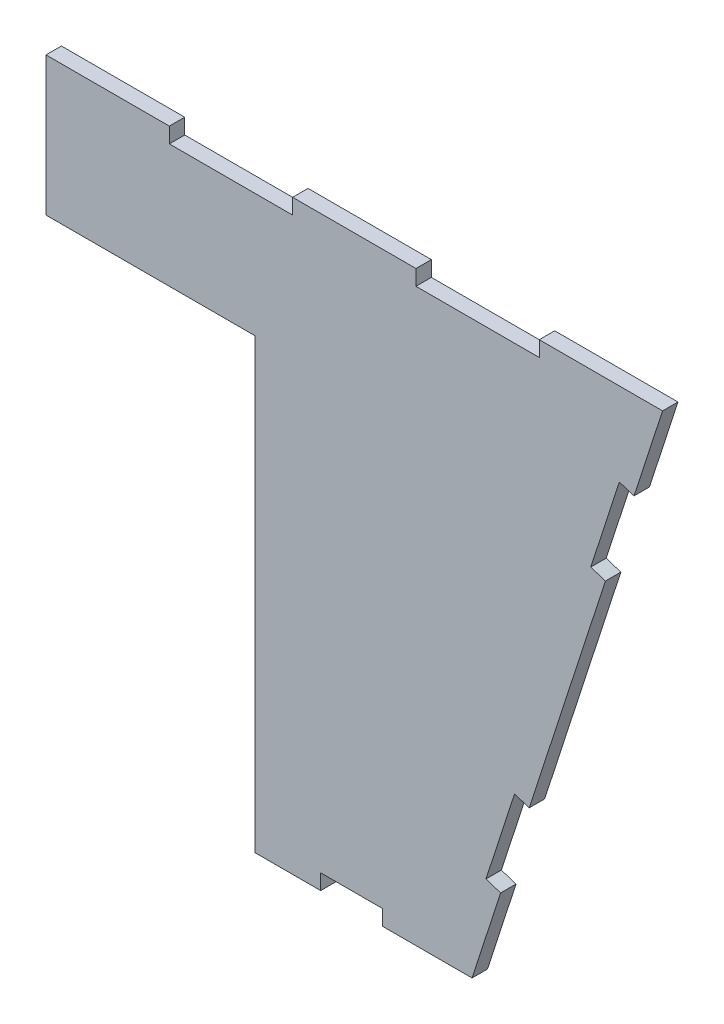
ISO-10303-21;
HEADER;
FILE_DESCRIPTION(('STEP AP214'),'2;1');
FILE_NAME('part.step','',(''),(''),'','','');
FILE_SCHEMA(('AUTOMOTIVE_DESIGN { 1 0 10303 214 1 1 1 1 }'));
ENDSEC;
DATA;
#1=APPLICATION_CONTEXT('core data for automotive mechanical design processes');
#2=APPLICATION_PROTOCOL_DEFINITION('international standard','automotive_design',2000,#1);
#3=PRODUCT_CONTEXT('',#1,'mechanical');
#4=PRODUCT('Part','Part','',(#3));
#5=PRODUCT_RELATED_PRODUCT_CATEGORY('part','',(#4));
#6=PRODUCT_DEFINITION_FORMATION('','',#4);
#7=PRODUCT_DEFINITION_CONTEXT('part definition',#1,'design');
#8=PRODUCT_DEFINITION('design','',#6,#7);
#9=PRODUCT_DEFINITION_SHAPE('','',#8);
#10=(LENGTH_UNIT() NAMED_UNIT(*) SI_UNIT(.MILLI.,.METRE.));
#11=(NAMED_UNIT(*) PLANE_ANGLE_UNIT() SI_UNIT($,.RADIAN.));
#12=(NAMED_UNIT(*) SI_UNIT($,.STERADIAN.) SOLID_ANGLE_UNIT());
#13=UNCERTAINTY_MEASURE_WITH_UNIT(LENGTH_MEASURE(1.E-05),#10,'distance_accuracy_value','');
#14=(GEOMETRIC_REPRESENTATION_CONTEXT(3) GLOBAL_UNCERTAINTY_ASSIGNED_CONTEXT((#13)) GLOBAL_UNIT_ASSIGNED_CONTEXT((#10,
#11,#12)) REPRESENTATION_CONTEXT('',''));
#15=CARTESIAN_POINT('',(0.,0.,0.));
#16=DIRECTION('',(0.,0.,1.));
#17=DIRECTION('',(1.,0.,0.));
#18=AXIS2_PLACEMENT_3D('',#15,#16,#17);
#19=CARTESIAN_POINT('',(-18.477420857191,0.,3.175));
#20=DIRECTION('',(0.,1.,0.));
#21=DIRECTION('',(0.,0.,1.));
#22=AXIS2_PLACEMENT_3D('',#19,#20,#21);
#23=PLANE('',#22);
#24=DIRECTION('',(1.,0.,0.));
#25=VECTOR('',#24,1.);
#26=CARTESIAN_POINT('',(-18.477420857191,0.,0.));
#27=LINE('',#26,#25);
#28=CARTESIAN_POINT('',(-18.477420857191,0.,0.));
#29=VERTEX_POINT('',#28);
#30=CARTESIAN_POINT('',(0.,0.,0.));
#31=VERTEX_POINT('',#30);
#32=EDGE_CURVE('E239',#29,#31,#27,.T.);
#33=ORIENTED_EDGE('',*,*,#32,.T.);
#34=DIRECTION('',(0.,0.,-1.));
#35=VECTOR('',#34,1.);
#36=CARTESIAN_POINT('',(0.,0.,3.175));
#37=LINE('',#36,#35);
#38=CARTESIAN_POINT('',(0.,0.,3.175));
#39=VERTEX_POINT('',#38);
#40=EDGE_CURVE('E11',#39,#31,#37,.T.);
#41=ORIENTED_EDGE('',*,*,#40,.F.);
#42=DIRECTION('',(1.,0.,0.));
#43=VECTOR('',#42,1.);
#44=CARTESIAN_POINT('',(-18.477420857191,0.,3.175));
#45=LINE('',#44,#43);
#46=CARTESIAN_POINT('',(-18.477420857191,0.,3.175));
#47=VERTEX_POINT('',#46);
#48=EDGE_CURVE('E289',#47,#39,#45,.T.);
#49=ORIENTED_EDGE('',*,*,#48,.F.);
#50=DIRECTION('',(0.,0.,-1.));
#51=VECTOR('',#50,1.);
#52=CARTESIAN_POINT('',(-18.477420857191,0.,3.175));
#53=LINE('',#52,#51);
#54=EDGE_CURVE('E235',#47,#29,#53,.T.);
#55=ORIENTED_EDGE('',*,*,#54,.T.);
#56=EDGE_LOOP('',(#33,#41,#49,#55));
#57=FACE_BOUND('',#56,.T.);
#58=ADVANCED_FACE('F35',(#57),#23,.F.);
#59=CARTESIAN_POINT('',(0.,0.,3.175));
#60=DIRECTION('',(-0.951056516295155,0.309016994374945,0.));
#61=DIRECTION('',(-0.309016994374945,-0.951056516295155,0.));
#62=AXIS2_PLACEMENT_3D('',#59,#60,#61);
#63=PLANE('',#62);
#64=DIRECTION('',(0.309016994374945,0.951056516295154,0.));
#65=VECTOR('',#64,1.);
#66=CARTESIAN_POINT('',(0.,0.,0.));
#67=LINE('',#66,#65);
#68=CARTESIAN_POINT('',(5.88677374284271,18.1176266354227,0.));
#69=VERTEX_POINT('',#68);
#70=EDGE_CURVE('E242',#31,#69,#67,.T.);
#71=ORIENTED_EDGE('',*,*,#70,.T.);
#72=DIRECTION('',(0.,0.,-1.));
#73=VECTOR('',#72,1.);
#74=CARTESIAN_POINT('',(5.88677374284271,18.1176266354227,3.175));
#75=LINE('',#74,#73);
#76=CARTESIAN_POINT('',(5.88677374284271,18.1176266354227,3.175));
#77=VERTEX_POINT('',#76);
#78=EDGE_CURVE('E43',#77,#69,#75,.T.);
#79=ORIENTED_EDGE('',*,*,#78,.F.);
#80=DIRECTION('',(0.309016994374945,0.951056516295154,0.));
#81=VECTOR('',#80,1.);
#82=CARTESIAN_POINT('',(0.,0.,3.175));
#83=LINE('',#82,#81);
#84=EDGE_CURVE('E148',#39,#77,#83,.T.);
#85=ORIENTED_EDGE('',*,*,#84,.F.);
#86=ORIENTED_EDGE('',*,*,#40,.T.);
#87=EDGE_LOOP('',(#71,#79,#85,#86));
#88=FACE_BOUND('',#87,.T.);
#89=ADVANCED_FACE('F437',(#88),#63,.F.);
#90=CARTESIAN_POINT('',(5.88677374284271,18.1176266354227,3.175));
#91=DIRECTION('',(-0.309016994374942,-0.951056516295155,0.));
#92=DIRECTION('',(0.951056516295155,-0.309016994374942,0.));
#93=AXIS2_PLACEMENT_3D('',#90,#91,#92);
#94=PLANE('',#93);
#95=DIRECTION('',(-0.951056516295155,0.309016994374942,0.));
#96=VECTOR('',#95,1.);
#97=CARTESIAN_POINT('',(5.88677374284271,18.1176266354227,0.));
#98=LINE('',#97,#96);
#99=CARTESIAN_POINT('',(2.86716930360559,19.0987555925632,0.));
#100=VERTEX_POINT('',#99);
#101=EDGE_CURVE('E244',#69,#100,#98,.T.);
#102=ORIENTED_EDGE('',*,*,#101,.T.);
#103=DIRECTION('',(0.,0.,-1.));
#104=VECTOR('',#103,1.);
#105=CARTESIAN_POINT('',(2.86716930360559,19.0987555925632,3.175));
#106=LINE('',#105,#104);
#107=CARTESIAN_POINT('',(2.86716930360559,19.0987555925632,3.175));
#108=VERTEX_POINT('',#107);
#109=EDGE_CURVE('E350',#108,#100,#106,.T.);
#110=ORIENTED_EDGE('',*,*,#109,.F.);
#111=DIRECTION('',(-0.951056516295155,0.309016994374942,0.));
#112=VECTOR('',#111,1.);
#113=CARTESIAN_POINT('',(5.88677374284271,18.1176266354227,3.175));
#114=LINE('',#113,#112);
#115=EDGE_CURVE('E358',#77,#108,#114,.T.);
#116=ORIENTED_EDGE('',*,*,#115,.F.);
#117=ORIENTED_EDGE('',*,*,#78,.T.);
#118=EDGE_LOOP('',(#102,#110,#116,#117));
#119=FACE_BOUND('',#118,.T.);
#120=ADVANCED_FACE('F356',(#119),#94,.F.);
#121=CARTESIAN_POINT('',(2.86716930360559,19.0987555925632,3.175));
#122=DIRECTION('',(-0.951056516295154,0.309016994374946,0.));
#123=DIRECTION('',(-0.309016994374946,-0.951056516295154,0.));
#124=AXIS2_PLACEMENT_3D('',#121,#122,#123);
#125=PLANE('',#124);
#126=DIRECTION('',(0.309016994374946,0.951056516295154,0.));
#127=VECTOR('',#126,1.);
#128=CARTESIAN_POINT('',(2.86716930360559,19.0987555925632,0.));
#129=LINE('',#128,#127);
#130=CARTESIAN_POINT('',(8.75394304644831,37.2163822279859,0.));
#131=VERTEX_POINT('',#130);
#132=EDGE_CURVE('E246',#100,#131,#129,.T.);
#133=ORIENTED_EDGE('',*,*,#132,.T.);
#134=DIRECTION('',(0.,0.,-1.));
#135=VECTOR('',#134,1.);
#136=CARTESIAN_POINT('',(8.75394304644831,37.2163822279859,3.175));
#137=LINE('',#136,#135);
#138=CARTESIAN_POINT('',(8.75394304644831,37.2163822279859,3.175));
#139=VERTEX_POINT('',#138);
#140=EDGE_CURVE('E347',#139,#131,#137,.T.);
#141=ORIENTED_EDGE('',*,*,#140,.F.);
#142=DIRECTION('',(0.309016994374946,0.951056516295154,0.));
#143=VECTOR('',#142,1.);
#144=CARTESIAN_POINT('',(2.86716930360559,19.0987555925632,3.175));
#145=LINE('',#144,#143);
#146=EDGE_CURVE('E376',#108,#139,#145,.T.);
#147=ORIENTED_EDGE('',*,*,#146,.F.);
#148=ORIENTED_EDGE('',*,*,#109,.T.);
#149=EDGE_LOOP('',(#133,#141,#147,#148));
#150=FACE_BOUND('',#149,.T.);
#151=ADVANCED_FACE('F367',(#150),#125,.F.);
#152=CARTESIAN_POINT('',(8.75394304644831,37.2163822279859,3.175));
#153=DIRECTION('',(0.309016994374942,0.951056516295155,0.));
#154=DIRECTION('',(-0.951056516295155,0.309016994374942,0.));
#155=AXIS2_PLACEMENT_3D('',#152,#153,#154);
#156=PLANE('',#155);
#157=DIRECTION('',(0.951056516295155,-0.309016994374942,0.));
#158=VECTOR('',#157,1.);
#159=CARTESIAN_POINT('',(8.75394304644831,37.2163822279859,0.));
#160=LINE('',#159,#158);
#161=CARTESIAN_POINT('',(11.7735474856854,36.2352532708454,0.));
#162=VERTEX_POINT('',#161);
#163=EDGE_CURVE('E248',#131,#162,#160,.T.);
#164=ORIENTED_EDGE('',*,*,#163,.T.);
#165=DIRECTION('',(0.,0.,-1.));
#166=VECTOR('',#165,1.);
#167=CARTESIAN_POINT('',(11.7735474856854,36.2352532708454,3.175));
#168=LINE('',#167,#166);
#169=CARTESIAN_POINT('',(11.7735474856854,36.2352532708454,3.175));
#170=VERTEX_POINT('',#169);
#171=EDGE_CURVE('E344',#170,#162,#168,.T.);
#172=ORIENTED_EDGE('',*,*,#171,.F.);
#173=DIRECTION('',(0.951056516295155,-0.309016994374942,0.));
#174=VECTOR('',#173,1.);
#175=CARTESIAN_POINT('',(8.75394304644831,37.2163822279859,3.175));
#176=LINE('',#175,#174);
#177=EDGE_CURVE('E373',#139,#170,#176,.T.);
#178=ORIENTED_EDGE('',*,*,#177,.F.);
#179=ORIENTED_EDGE('',*,*,#140,.T.);
#180=EDGE_LOOP('',(#164,#172,#178,#179));
#181=FACE_BOUND('',#180,.T.);
#182=ADVANCED_FACE('F371',(#181),#156,.F.);
#183=CARTESIAN_POINT('',(11.7735474856854,36.2352532708454,3.175));
#184=DIRECTION('',(-0.951056516295154,0.309016994374945,0.));
#185=DIRECTION('',(-0.309016994374945,-0.951056516295155,0.));
#186=AXIS2_PLACEMENT_3D('',#183,#184,#185);
#187=PLANE('',#186);
#188=DIRECTION('',(0.309016994374945,0.951056516295154,0.));
#189=VECTOR('',#188,1.);
#190=CARTESIAN_POINT('',(11.7735474856854,36.2352532708454,0.));
#191=LINE('',#190,#189);
#192=CARTESIAN_POINT('',(27.4716107999326,84.5489242986392,0.));
#193=VERTEX_POINT('',#192);
#194=EDGE_CURVE('E250',#162,#193,#191,.T.);
#195=ORIENTED_EDGE('',*,*,#194,.T.);
#196=DIRECTION('',(0.,0.,-1.));
#197=VECTOR('',#196,1.);
#198=CARTESIAN_POINT('',(27.4716107999326,84.5489242986392,3.175));
#199=LINE('',#198,#197);
#200=CARTESIAN_POINT('',(27.4716107999326,84.5489242986392,3.175));
#201=VERTEX_POINT('',#200);
#202=EDGE_CURVE('E341',#201,#193,#199,.T.);
#203=ORIENTED_EDGE('',*,*,#202,.F.);
#204=DIRECTION('',(0.309016994374945,0.951056516295154,0.));
#205=VECTOR('',#204,1.);
#206=CARTESIAN_POINT('',(11.7735474856854,36.2352532708454,3.175));
#207=LINE('',#206,#205);
#208=EDGE_CURVE('E375',#170,#201,#207,.T.);
#209=ORIENTED_EDGE('',*,*,#208,.F.);
#210=ORIENTED_EDGE('',*,*,#171,.T.);
#211=EDGE_LOOP('',(#195,#203,#209,#210));
#212=FACE_BOUND('',#211,.T.);
#213=ADVANCED_FACE('F450',(#212),#187,.F.);
#214=CARTESIAN_POINT('',(24.4520063606955,85.5300532557796,3.175));
#215=DIRECTION('',(-0.309016994374941,-0.951056516295156,0.));
#216=DIRECTION('',(0.951056516295156,-0.309016994374941,0.));
#217=AXIS2_PLACEMENT_3D('',#214,#215,#216);
#218=PLANE('',#217);
#219=DIRECTION('',(-0.951056516295155,0.309016994374941,0.));
#220=VECTOR('',#219,1.);
#221=CARTESIAN_POINT('',(24.4520063606955,85.5300532557796,0.));
#222=LINE('',#221,#220);
#223=CARTESIAN_POINT('',(24.4520063606955,85.5300532557796,0.));
#224=VERTEX_POINT('',#223);
#225=EDGE_CURVE('E252',#193,#224,#222,.T.);
#226=ORIENTED_EDGE('',*,*,#225,.T.);
#227=DIRECTION('',(0.,0.,-1.));
#228=VECTOR('',#227,1.);
#229=CARTESIAN_POINT('',(24.4520063606955,85.5300532557796,3.175));
#230=LINE('',#229,#228);
#231=CARTESIAN_POINT('',(24.4520063606955,85.5300532557796,3.175));
#232=VERTEX_POINT('',#231);
#233=EDGE_CURVE('E338',#232,#224,#230,.T.);
#234=ORIENTED_EDGE('',*,*,#233,.F.);
#235=DIRECTION('',(-0.951056516295155,0.309016994374941,0.));
#236=VECTOR('',#235,1.);
#237=CARTESIAN_POINT('',(24.4520063606955,85.5300532557796,3.175));
#238=LINE('',#237,#236);
#239=EDGE_CURVE('E378',#201,#232,#238,.T.);
#240=ORIENTED_EDGE('',*,*,#239,.F.);
#241=ORIENTED_EDGE('',*,*,#202,.T.);
#242=EDGE_LOOP('',(#226,#234,#240,#241));
#243=FACE_BOUND('',#242,.T.);
#244=ADVANCED_FACE('F453',(#243),#218,.F.);
#245=CARTESIAN_POINT('',(30.3387801035382,103.647679891202,3.175));
#246=DIRECTION('',(-0.951056516295155,0.309016994374944,0.));
#247=DIRECTION('',(-0.309016994374944,-0.951056516295155,0.));
#248=AXIS2_PLACEMENT_3D('',#245,#246,#247);
#249=PLANE('',#248);
#250=DIRECTION('',(0.309016994374944,0.951056516295155,0.));
#251=VECTOR('',#250,1.);
#252=CARTESIAN_POINT('',(30.3387801035382,103.647679891202,0.));
#253=LINE('',#252,#251);
#254=CARTESIAN_POINT('',(30.3387801035382,103.647679891202,0.));
#255=VERTEX_POINT('',#254);
#256=EDGE_CURVE('E254',#224,#255,#253,.T.);
#257=ORIENTED_EDGE('',*,*,#256,.T.);
#258=DIRECTION('',(0.,0.,-1.));
#259=VECTOR('',#258,1.);
#260=CARTESIAN_POINT('',(30.3387801035382,103.647679891202,3.175));
#261=LINE('',#260,#259);
#262=CARTESIAN_POINT('',(30.3387801035382,103.647679891202,3.175));
#263=VERTEX_POINT('',#262);
#264=EDGE_CURVE('E335',#263,#255,#261,.T.);
#265=ORIENTED_EDGE('',*,*,#264,.F.);
#266=DIRECTION('',(0.309016994374944,0.951056516295155,0.));
#267=VECTOR('',#266,1.);
#268=CARTESIAN_POINT('',(30.3387801035382,103.647679891202,3.175));
#269=LINE('',#268,#267);
#270=EDGE_CURVE('E384',#232,#263,#269,.T.);
#271=ORIENTED_EDGE('',*,*,#270,.F.);
#272=ORIENTED_EDGE('',*,*,#233,.T.);
#273=EDGE_LOOP('',(#257,#265,#271,#272));
#274=FACE_BOUND('',#273,.T.);
#275=ADVANCED_FACE('F457',(#274),#249,.F.);
#276=CARTESIAN_POINT('',(33.3583845427752,102.666550934062,3.175));
#277=DIRECTION('',(0.309016994374943,0.951056516295155,0.));
#278=DIRECTION('',(-0.951056516295155,0.309016994374943,0.));
#279=AXIS2_PLACEMENT_3D('',#276,#277,#278);
#280=PLANE('',#279);
#281=DIRECTION('',(0.951056516295155,-0.309016994374943,0.));
#282=VECTOR('',#281,1.);
#283=CARTESIAN_POINT('',(33.3583845427752,102.666550934062,0.));
#284=LINE('',#283,#282);
#285=CARTESIAN_POINT('',(33.3583845427752,102.666550934062,0.));
#286=VERTEX_POINT('',#285);
#287=EDGE_CURVE('E256',#255,#286,#284,.T.);
#288=ORIENTED_EDGE('',*,*,#287,.T.);
#289=DIRECTION('',(0.,0.,-1.));
#290=VECTOR('',#289,1.);
#291=CARTESIAN_POINT('',(33.3583845427752,102.666550934062,3.175));
#292=LINE('',#291,#290);
#293=CARTESIAN_POINT('',(33.3583845427752,102.666550934062,3.175));
#294=VERTEX_POINT('',#293);
#295=EDGE_CURVE('E332',#294,#286,#292,.T.);
#296=ORIENTED_EDGE('',*,*,#295,.F.);
#297=DIRECTION('',(0.951056516295155,-0.309016994374943,0.));
#298=VECTOR('',#297,1.);
#299=CARTESIAN_POINT('',(33.3583845427752,102.666550934062,3.175));
#300=LINE('',#299,#298);
#301=EDGE_CURVE('E386',#263,#294,#300,.T.);
#302=ORIENTED_EDGE('',*,*,#301,.F.);
#303=ORIENTED_EDGE('',*,*,#264,.T.);
#304=EDGE_LOOP('',(#288,#296,#302,#303));
#305=FACE_BOUND('',#304,.T.);
#306=ADVANCED_FACE('F461',(#305),#280,.F.);
#307=CARTESIAN_POINT('',(33.3583845427752,102.666550934062,3.175));
#308=DIRECTION('',(-0.951056516295154,0.309016994374946,0.));
#309=DIRECTION('',(-0.309016994374946,-0.951056516295154,0.));
#310=AXIS2_PLACEMENT_3D('',#307,#308,#309);
#311=PLANE('',#310);
#312=DIRECTION('',(0.309016994374946,0.951056516295154,0.));
#313=VECTOR('',#312,1.);
#314=CARTESIAN_POINT('',(33.3583845427752,102.666550934062,0.));
#315=LINE('',#314,#313);
#316=CARTESIAN_POINT('',(39.245158285618,120.784177569485,0.));
#317=VERTEX_POINT('',#316);
#318=EDGE_CURVE('E258',#286,#317,#315,.T.);
#319=ORIENTED_EDGE('',*,*,#318,.T.);
#320=DIRECTION('',(0.,0.,-1.));
#321=VECTOR('',#320,1.);
#322=CARTESIAN_POINT('',(39.245158285618,120.784177569485,3.175));
#323=LINE('',#322,#321);
#324=CARTESIAN_POINT('',(39.245158285618,120.784177569485,3.175));
#325=VERTEX_POINT('',#324);
#326=EDGE_CURVE('E329',#325,#317,#323,.T.);
#327=ORIENTED_EDGE('',*,*,#326,.F.);
#328=DIRECTION('',(0.309016994374946,0.951056516295154,0.));
#329=VECTOR('',#328,1.);
#330=CARTESIAN_POINT('',(33.3583845427752,102.666550934062,3.175));
#331=LINE('',#330,#329);
#332=EDGE_CURVE('E388',#294,#325,#331,.T.);
#333=ORIENTED_EDGE('',*,*,#332,.F.);
#334=ORIENTED_EDGE('',*,*,#295,.T.);
#335=EDGE_LOOP('',(#319,#327,#333,#334));
#336=FACE_BOUND('',#335,.T.);
#337=ADVANCED_FACE('F465',(#336),#311,.F.);
#338=CARTESIAN_POINT('',(39.245158285618,120.784177569485,3.175));
#339=DIRECTION('',(0.,-1.,0.));
#340=DIRECTION('',(0.,0.,-1.));
#341=AXIS2_PLACEMENT_3D('',#338,#339,#340);
#342=PLANE('',#341);
#343=DIRECTION('',(-1.,0.,0.));
#344=VECTOR('',#343,1.);
#345=CARTESIAN_POINT('',(39.245158285618,120.784177569485,0.));
#346=LINE('',#345,#344);
#347=CARTESIAN_POINT('',(13.845158285618,120.784177569485,0.));
#348=VERTEX_POINT('',#347);
#349=EDGE_CURVE('E260',#317,#348,#346,.T.);
#350=ORIENTED_EDGE('',*,*,#349,.T.);
#351=DIRECTION('',(0.,0.,-1.));
#352=VECTOR('',#351,1.);
#353=CARTESIAN_POINT('',(13.845158285618,120.784177569485,3.175));
#354=LINE('',#353,#352);
#355=CARTESIAN_POINT('',(13.845158285618,120.784177569485,3.175));
#356=VERTEX_POINT('',#355);
#357=EDGE_CURVE('E326',#356,#348,#354,.T.);
#358=ORIENTED_EDGE('',*,*,#357,.F.);
#359=DIRECTION('',(-1.,0.,0.));
#360=VECTOR('',#359,1.);
#361=CARTESIAN_POINT('',(39.245158285618,120.784177569485,3.175));
#362=LINE('',#361,#360);
#363=EDGE_CURVE('E390',#325,#356,#362,.T.);
#364=ORIENTED_EDGE('',*,*,#363,.F.);
#365=ORIENTED_EDGE('',*,*,#326,.T.);
#366=EDGE_LOOP('',(#350,#358,#364,#365));
#367=FACE_BOUND('',#366,.T.);
#368=ADVANCED_FACE('F469',(#367),#342,.F.);
#369=CARTESIAN_POINT('',(13.845158285618,120.784177569485,3.175));
#370=DIRECTION('',(1.,0.,0.));
#371=DIRECTION('',(0.,0.,-1.));
#372=AXIS2_PLACEMENT_3D('',#369,#370,#371);
#373=PLANE('',#372);
#374=DIRECTION('',(0.,-1.,0.));
#375=VECTOR('',#374,1.);
#376=CARTESIAN_POINT('',(13.845158285618,120.784177569485,0.));
#377=LINE('',#376,#375);
#378=CARTESIAN_POINT('',(13.845158285618,117.609177569485,0.));
#379=VERTEX_POINT('',#378);
#380=EDGE_CURVE('E262',#348,#379,#377,.T.);
#381=ORIENTED_EDGE('',*,*,#380,.T.);
#382=DIRECTION('',(0.,0.,-1.));
#383=VECTOR('',#382,1.);
#384=CARTESIAN_POINT('',(13.845158285618,117.609177569485,3.175));
#385=LINE('',#384,#383);
#386=CARTESIAN_POINT('',(13.845158285618,117.609177569485,3.175));
#387=VERTEX_POINT('',#386);
#388=EDGE_CURVE('E323',#387,#379,#385,.T.);
#389=ORIENTED_EDGE('',*,*,#388,.F.);
#390=DIRECTION('',(0.,-1.,0.));
#391=VECTOR('',#390,1.);
#392=CARTESIAN_POINT('',(13.845158285618,120.784177569485,3.175));
#393=LINE('',#392,#391);
#394=EDGE_CURVE('E392',#356,#387,#393,.T.);
#395=ORIENTED_EDGE('',*,*,#394,.F.);
#396=ORIENTED_EDGE('',*,*,#357,.T.);
#397=EDGE_LOOP('',(#381,#389,#395,#396));
#398=FACE_BOUND('',#397,.T.);
#399=ADVANCED_FACE('F473',(#398),#373,.F.);
#400=CARTESIAN_POINT('',(13.845158285618,117.609177569485,3.175));
#401=DIRECTION('',(0.,-1.,0.));
#402=DIRECTION('',(1.,0.,0.));
#403=AXIS2_PLACEMENT_3D('',#400,#401,#402);
#404=PLANE('',#403);
#405=DIRECTION('',(-1.,0.,0.));
#406=VECTOR('',#405,1.);
#407=CARTESIAN_POINT('',(13.845158285618,117.609177569485,0.));
#408=LINE('',#407,#406);
#409=CARTESIAN_POINT('',(-11.554841714382,117.609177569485,0.));
#410=VERTEX_POINT('',#409);
#411=EDGE_CURVE('E264',#379,#410,#408,.T.);
#412=ORIENTED_EDGE('',*,*,#411,.T.);
#413=DIRECTION('',(0.,0.,-1.));
#414=VECTOR('',#413,1.);
#415=CARTESIAN_POINT('',(-11.554841714382,117.609177569485,3.175));
#416=LINE('',#415,#414);
#417=CARTESIAN_POINT('',(-11.554841714382,117.609177569485,3.175));
#418=VERTEX_POINT('',#417);
#419=EDGE_CURVE('E320',#418,#410,#416,.T.);
#420=ORIENTED_EDGE('',*,*,#419,.F.);
#421=DIRECTION('',(-1.,0.,0.));
#422=VECTOR('',#421,1.);
#423=CARTESIAN_POINT('',(13.845158285618,117.609177569485,3.175));
#424=LINE('',#423,#422);
#425=EDGE_CURVE('E394',#387,#418,#424,.T.);
#426=ORIENTED_EDGE('',*,*,#425,.F.);
#427=ORIENTED_EDGE('',*,*,#388,.T.);
#428=EDGE_LOOP('',(#412,#420,#426,#427));
#429=FACE_BOUND('',#428,.T.);
#430=ADVANCED_FACE('F477',(#429),#404,.F.);
#431=CARTESIAN_POINT('',(-11.554841714382,117.609177569485,3.175));
#432=DIRECTION('',(-1.,0.,0.));
#433=DIRECTION('',(0.,0.,1.));
#434=AXIS2_PLACEMENT_3D('',#431,#432,#433);
#435=PLANE('',#434);
#436=DIRECTION('',(0.,1.,0.));
#437=VECTOR('',#436,1.);
#438=CARTESIAN_POINT('',(-11.554841714382,117.609177569485,0.));
#439=LINE('',#438,#437);
#440=CARTESIAN_POINT('',(-11.554841714382,120.784177569485,0.));
#441=VERTEX_POINT('',#440);
#442=EDGE_CURVE('E266',#410,#441,#439,.T.);
#443=ORIENTED_EDGE('',*,*,#442,.T.);
#444=DIRECTION('',(0.,0.,-1.));
#445=VECTOR('',#444,1.);
#446=CARTESIAN_POINT('',(-11.554841714382,120.784177569485,3.175));
#447=LINE('',#446,#445);
#448=CARTESIAN_POINT('',(-11.554841714382,120.784177569485,3.175));
#449=VERTEX_POINT('',#448);
#450=EDGE_CURVE('E317',#449,#441,#447,.T.);
#451=ORIENTED_EDGE('',*,*,#450,.F.);
#452=DIRECTION('',(0.,1.,0.));
#453=VECTOR('',#452,1.);
#454=CARTESIAN_POINT('',(-11.554841714382,117.609177569485,3.175));
#455=LINE('',#454,#453);
#456=EDGE_CURVE('E396',#418,#449,#455,.T.);
#457=ORIENTED_EDGE('',*,*,#456,.F.);
#458=ORIENTED_EDGE('',*,*,#419,.T.);
#459=EDGE_LOOP('',(#443,#451,#457,#458));
#460=FACE_BOUND('',#459,.T.);
#461=ADVANCED_FACE('F481',(#460),#435,.F.);
#462=CARTESIAN_POINT('',(-11.554841714382,120.784177569485,3.175));
#463=DIRECTION('',(0.,-1.,0.));
#464=DIRECTION('',(0.,0.,-1.));
#465=AXIS2_PLACEMENT_3D('',#462,#463,#464);
#466=PLANE('',#465);
#467=DIRECTION('',(-1.,0.,0.));
#468=VECTOR('',#467,1.);
#469=CARTESIAN_POINT('',(-11.554841714382,120.784177569485,0.));
#470=LINE('',#469,#468);
#471=CARTESIAN_POINT('',(-36.954841714382,120.784177569485,0.));
#472=VERTEX_POINT('',#471);
#473=EDGE_CURVE('E268',#441,#472,#470,.T.);
#474=ORIENTED_EDGE('',*,*,#473,.T.);
#475=DIRECTION('',(0.,0.,-1.));
#476=VECTOR('',#475,1.);
#477=CARTESIAN_POINT('',(-36.954841714382,120.784177569485,3.175));
#478=LINE('',#477,#476);
#479=CARTESIAN_POINT('',(-36.954841714382,120.784177569485,3.175));
#480=VERTEX_POINT('',#479);
#481=EDGE_CURVE('E314',#480,#472,#478,.T.);
#482=ORIENTED_EDGE('',*,*,#481,.F.);
#483=DIRECTION('',(-1.,0.,0.));
#484=VECTOR('',#483,1.);
#485=CARTESIAN_POINT('',(-11.554841714382,120.784177569485,3.175));
#486=LINE('',#485,#484);
#487=EDGE_CURVE('E398',#449,#480,#486,.T.);
#488=ORIENTED_EDGE('',*,*,#487,.F.);
#489=ORIENTED_EDGE('',*,*,#450,.T.);
#490=EDGE_LOOP('',(#474,#482,#488,#489));
#491=FACE_BOUND('',#490,.T.);
#492=ADVANCED_FACE('F485',(#491),#466,.F.);
#493=CARTESIAN_POINT('',(-36.954841714382,117.609177569485,3.175));
#494=DIRECTION('',(1.,0.,0.));
#495=DIRECTION('',(0.,0.,-1.));
#496=AXIS2_PLACEMENT_3D('',#493,#494,#495);
#497=PLANE('',#496);
#498=DIRECTION('',(0.,-1.,0.));
#499=VECTOR('',#498,1.);
#500=CARTESIAN_POINT('',(-36.954841714382,117.609177569485,0.));
#501=LINE('',#500,#499);
#502=CARTESIAN_POINT('',(-36.954841714382,117.609177569485,0.));
#503=VERTEX_POINT('',#502);
#504=EDGE_CURVE('E270',#472,#503,#501,.T.);
#505=ORIENTED_EDGE('',*,*,#504,.T.);
#506=DIRECTION('',(0.,0.,-1.));
#507=VECTOR('',#506,1.);
#508=CARTESIAN_POINT('',(-36.954841714382,117.609177569485,3.175));
#509=LINE('',#508,#507);
#510=CARTESIAN_POINT('',(-36.954841714382,117.609177569485,3.175));
#511=VERTEX_POINT('',#510);
#512=EDGE_CURVE('E311',#511,#503,#509,.T.);
#513=ORIENTED_EDGE('',*,*,#512,.F.);
#514=DIRECTION('',(0.,-1.,0.));
#515=VECTOR('',#514,1.);
#516=CARTESIAN_POINT('',(-36.954841714382,117.609177569485,3.175));
#517=LINE('',#516,#515);
#518=EDGE_CURVE('E400',#480,#511,#517,.T.);
#519=ORIENTED_EDGE('',*,*,#518,.F.);
#520=ORIENTED_EDGE('',*,*,#481,.T.);
#521=EDGE_LOOP('',(#505,#513,#519,#520));
#522=FACE_BOUND('',#521,.T.);
#523=ADVANCED_FACE('F489',(#522),#497,.F.);
#524=CARTESIAN_POINT('',(-62.354841714382,117.609177569485,3.175));
#525=DIRECTION('',(0.,-1.,0.));
#526=DIRECTION('',(0.,0.,-1.));
#527=AXIS2_PLACEMENT_3D('',#524,#525,#526);
#528=PLANE('',#527);
#529=DIRECTION('',(-1.,0.,0.));
#530=VECTOR('',#529,1.);
#531=CARTESIAN_POINT('',(-62.354841714382,117.609177569485,0.));
#532=LINE('',#531,#530);
#533=CARTESIAN_POINT('',(-62.354841714382,117.609177569485,0.));
#534=VERTEX_POINT('',#533);
#535=EDGE_CURVE('E272',#503,#534,#532,.T.);
#536=ORIENTED_EDGE('',*,*,#535,.T.);
#537=DIRECTION('',(0.,0.,-1.));
#538=VECTOR('',#537,1.);
#539=CARTESIAN_POINT('',(-62.354841714382,117.609177569485,3.175));
#540=LINE('',#539,#538);
#541=CARTESIAN_POINT('',(-62.354841714382,117.609177569485,3.175));
#542=VERTEX_POINT('',#541);
#543=EDGE_CURVE('E308',#542,#534,#540,.T.);
#544=ORIENTED_EDGE('',*,*,#543,.F.);
#545=DIRECTION('',(-1.,0.,0.));
#546=VECTOR('',#545,1.);
#547=CARTESIAN_POINT('',(-62.354841714382,117.609177569485,3.175));
#548=LINE('',#547,#546);
#549=EDGE_CURVE('E402',#511,#542,#548,.T.);
#550=ORIENTED_EDGE('',*,*,#549,.F.);
#551=ORIENTED_EDGE('',*,*,#512,.T.);
#552=EDGE_LOOP('',(#536,#544,#550,#551));
#553=FACE_BOUND('',#552,.T.);
#554=ADVANCED_FACE('F493',(#553),#528,.F.);
#555=CARTESIAN_POINT('',(-62.354841714382,120.784177569485,3.175));
#556=DIRECTION('',(-1.,0.,0.));
#557=DIRECTION('',(0.,0.,1.));
#558=AXIS2_PLACEMENT_3D('',#555,#556,#557);
#559=PLANE('',#558);
#560=DIRECTION('',(0.,1.,0.));
#561=VECTOR('',#560,1.);
#562=CARTESIAN_POINT('',(-62.354841714382,120.784177569485,0.));
#563=LINE('',#562,#561);
#564=CARTESIAN_POINT('',(-62.354841714382,120.784177569485,0.));
#565=VERTEX_POINT('',#564);
#566=EDGE_CURVE('E274',#534,#565,#563,.T.);
#567=ORIENTED_EDGE('',*,*,#566,.T.);
#568=DIRECTION('',(0.,0.,-1.));
#569=VECTOR('',#568,1.);
#570=CARTESIAN_POINT('',(-62.354841714382,120.784177569485,3.175));
#571=LINE('',#570,#569);
#572=CARTESIAN_POINT('',(-62.354841714382,120.784177569485,3.175));
#573=VERTEX_POINT('',#572);
#574=EDGE_CURVE('E305',#573,#565,#571,.T.);
#575=ORIENTED_EDGE('',*,*,#574,.F.);
#576=DIRECTION('',(0.,1.,0.));
#577=VECTOR('',#576,1.);
#578=CARTESIAN_POINT('',(-62.354841714382,120.784177569485,3.175));
#579=LINE('',#578,#577);
#580=EDGE_CURVE('E404',#542,#573,#579,.T.);
#581=ORIENTED_EDGE('',*,*,#580,.F.);
#582=ORIENTED_EDGE('',*,*,#543,.T.);
#583=EDGE_LOOP('',(#567,#575,#581,#582));
#584=FACE_BOUND('',#583,.T.);
#585=ADVANCED_FACE('F497',(#584),#559,.F.);
#586=CARTESIAN_POINT('',(-62.354841714382,120.784177569485,3.175));
#587=DIRECTION('',(0.,-1.,0.));
#588=DIRECTION('',(0.,0.,-1.));
#589=AXIS2_PLACEMENT_3D('',#586,#587,#588);
#590=PLANE('',#589);
#591=DIRECTION('',(-1.,0.,0.));
#592=VECTOR('',#591,1.);
#593=CARTESIAN_POINT('',(-62.354841714382,120.784177569485,0.));
#594=LINE('',#593,#592);
#595=CARTESIAN_POINT('',(-87.754841714382,120.784177569485,0.));
#596=VERTEX_POINT('',#595);
#597=EDGE_CURVE('E276',#565,#596,#594,.T.);
#598=ORIENTED_EDGE('',*,*,#597,.T.);
#599=DIRECTION('',(0.,0.,-1.));
#600=VECTOR('',#599,1.);
#601=CARTESIAN_POINT('',(-87.754841714382,120.784177569485,3.175));
#602=LINE('',#601,#600);
#603=CARTESIAN_POINT('',(-87.754841714382,120.784177569485,3.175));
#604=VERTEX_POINT('',#603);
#605=EDGE_CURVE('E302',#604,#596,#602,.T.);
#606=ORIENTED_EDGE('',*,*,#605,.F.);
#607=DIRECTION('',(-1.,0.,0.));
#608=VECTOR('',#607,1.);
#609=CARTESIAN_POINT('',(-62.354841714382,120.784177569485,3.175));
#610=LINE('',#609,#608);
#611=EDGE_CURVE('E406',#573,#604,#610,.T.);
#612=ORIENTED_EDGE('',*,*,#611,.F.);
#613=ORIENTED_EDGE('',*,*,#574,.T.);
#614=EDGE_LOOP('',(#598,#606,#612,#613));
#615=FACE_BOUND('',#614,.T.);
#616=ADVANCED_FACE('F501',(#615),#590,.F.);
#617=CARTESIAN_POINT('',(-87.754841714382,120.784177569485,3.175));
#618=DIRECTION('',(1.,0.,0.));
#619=DIRECTION('',(0.,0.,-1.));
#620=AXIS2_PLACEMENT_3D('',#617,#618,#619);
#621=PLANE('',#620);
#622=DIRECTION('',(0.,-1.,0.));
#623=VECTOR('',#622,1.);
#624=CARTESIAN_POINT('',(-87.754841714382,120.784177569485,0.));
#625=LINE('',#624,#623);
#626=CARTESIAN_POINT('',(-87.754841714382,92.2091775694846,0.));
#627=VERTEX_POINT('',#626);
#628=EDGE_CURVE('E278',#596,#627,#625,.T.);
#629=ORIENTED_EDGE('',*,*,#628,.T.);
#630=DIRECTION('',(0.,0.,-1.));
#631=VECTOR('',#630,1.);
#632=CARTESIAN_POINT('',(-87.754841714382,92.2091775694846,3.175));
#633=LINE('',#632,#631);
#634=CARTESIAN_POINT('',(-87.754841714382,92.2091775694846,3.175));
#635=VERTEX_POINT('',#634);
#636=EDGE_CURVE('E299',#635,#627,#633,.T.);
#637=ORIENTED_EDGE('',*,*,#636,.F.);
#638=DIRECTION('',(0.,-1.,0.));
#639=VECTOR('',#638,1.);
#640=CARTESIAN_POINT('',(-87.754841714382,120.784177569485,3.175));
#641=LINE('',#640,#639);
#642=EDGE_CURVE('E408',#604,#635,#641,.T.);
#643=ORIENTED_EDGE('',*,*,#642,.F.);
#644=ORIENTED_EDGE('',*,*,#605,.T.);
#645=EDGE_LOOP('',(#629,#637,#643,#644));
#646=FACE_BOUND('',#645,.T.);
#647=ADVANCED_FACE('F505',(#646),#621,.F.);
#648=CARTESIAN_POINT('',(-44.6599105147231,92.2091775694846,3.175));
#649=DIRECTION('',(0.,1.,0.));
#650=DIRECTION('',(0.,0.,1.));
#651=AXIS2_PLACEMENT_3D('',#648,#649,#650);
#652=PLANE('',#651);
#653=DIRECTION('',(1.,0.,0.));
#654=VECTOR('',#653,1.);
#655=CARTESIAN_POINT('',(-44.6599105147231,92.2091775694846,0.));
#656=LINE('',#655,#654);
#657=CARTESIAN_POINT('',(-44.6599105147231,92.2091775694846,0.));
#658=VERTEX_POINT('',#657);
#659=EDGE_CURVE('E280',#627,#658,#656,.T.);
#660=ORIENTED_EDGE('',*,*,#659,.T.);
#661=DIRECTION('',(0.,0.,-1.));
#662=VECTOR('',#661,1.);
#663=CARTESIAN_POINT('',(-44.6599105147231,92.2091775694846,3.175));
#664=LINE('',#663,#662);
#665=CARTESIAN_POINT('',(-44.6599105147231,92.2091775694846,3.175));
#666=VERTEX_POINT('',#665);
#667=EDGE_CURVE('E296',#666,#658,#664,.T.);
#668=ORIENTED_EDGE('',*,*,#667,.F.);
#669=DIRECTION('',(1.,0.,0.));
#670=VECTOR('',#669,1.);
#671=CARTESIAN_POINT('',(-44.6599105147231,92.2091775694846,3.175));
#672=LINE('',#671,#670);
#673=EDGE_CURVE('E410',#635,#666,#672,.T.);
#674=ORIENTED_EDGE('',*,*,#673,.F.);
#675=ORIENTED_EDGE('',*,*,#636,.T.);
#676=EDGE_LOOP('',(#660,#668,#674,#675));
#677=FACE_BOUND('',#676,.T.);
#678=ADVANCED_FACE('F509',(#677),#652,.F.);
#679=CARTESIAN_POINT('',(-44.6599105147231,0.,3.175));
#680=DIRECTION('',(1.,0.,0.));
#681=DIRECTION('',(0.,0.,-1.));
#682=AXIS2_PLACEMENT_3D('',#679,#680,#681);
#683=PLANE('',#682);
#684=DIRECTION('',(0.,-1.,0.));
#685=VECTOR('',#684,1.);
#686=CARTESIAN_POINT('',(-44.6599105147231,0.,0.));
#687=LINE('',#686,#685);
#688=CARTESIAN_POINT('',(-44.6599105147231,0.,0.));
#689=VERTEX_POINT('',#688);
#690=EDGE_CURVE('E282',#658,#689,#687,.T.);
#691=ORIENTED_EDGE('',*,*,#690,.T.);
#692=DIRECTION('',(0.,0.,-1.));
#693=VECTOR('',#692,1.);
#694=CARTESIAN_POINT('',(-44.6599105147231,0.,3.175));
#695=LINE('',#694,#693);
#696=CARTESIAN_POINT('',(-44.6599105147231,0.,3.175));
#697=VERTEX_POINT('',#696);
#698=EDGE_CURVE('E293',#697,#689,#695,.T.);
#699=ORIENTED_EDGE('',*,*,#698,.F.);
#700=DIRECTION('',(0.,-1.,0.));
#701=VECTOR('',#700,1.);
#702=CARTESIAN_POINT('',(-44.6599105147231,0.,3.175));
#703=LINE('',#702,#701);
#704=EDGE_CURVE('E412',#666,#697,#703,.T.);
#705=ORIENTED_EDGE('',*,*,#704,.F.);
#706=ORIENTED_EDGE('',*,*,#667,.T.);
#707=EDGE_LOOP('',(#691,#699,#705,#706));
#708=FACE_BOUND('',#707,.T.);
#709=ADVANCED_FACE('F418',(#708),#683,.F.);
#710=CARTESIAN_POINT('',(-44.6599105147231,0.,3.175));
#711=DIRECTION('',(0.,1.,0.));
#712=DIRECTION('',(0.,0.,1.));
#713=AXIS2_PLACEMENT_3D('',#710,#711,#712);
#714=PLANE('',#713);
#715=DIRECTION('',(1.,0.,0.));
#716=VECTOR('',#715,1.);
#717=CARTESIAN_POINT('',(-44.6599105147231,0.,0.));
#718=LINE('',#717,#716);
#719=CARTESIAN_POINT('',(-31.177420857191,0.,0.));
#720=VERTEX_POINT('',#719);
#721=EDGE_CURVE('E284',#689,#720,#718,.T.);
#722=ORIENTED_EDGE('',*,*,#721,.T.);
#723=DIRECTION('',(0.,0.,-1.));
#724=VECTOR('',#723,1.);
#725=CARTESIAN_POINT('',(-31.177420857191,0.,3.175));
#726=LINE('',#725,#724);
#727=CARTESIAN_POINT('',(-31.177420857191,0.,3.175));
#728=VERTEX_POINT('',#727);
#729=EDGE_CURVE('E230',#728,#720,#726,.T.);
#730=ORIENTED_EDGE('',*,*,#729,.F.);
#731=DIRECTION('',(1.,0.,0.));
#732=VECTOR('',#731,1.);
#733=CARTESIAN_POINT('',(-44.6599105147231,0.,3.175));
#734=LINE('',#733,#732);
#735=EDGE_CURVE('E221',#697,#728,#734,.T.);
#736=ORIENTED_EDGE('',*,*,#735,.F.);
#737=ORIENTED_EDGE('',*,*,#698,.T.);
#738=EDGE_LOOP('',(#722,#730,#736,#737));
#739=FACE_BOUND('',#738,.T.);
#740=ADVANCED_FACE('F422',(#739),#714,.F.);
#741=CARTESIAN_POINT('',(-31.177420857191,3.175,3.175));
#742=DIRECTION('',(-1.,0.,0.));
#743=DIRECTION('',(0.,0.,1.));
#744=AXIS2_PLACEMENT_3D('',#741,#742,#743);
#745=PLANE('',#744);
#746=DIRECTION('',(0.,1.,0.));
#747=VECTOR('',#746,1.);
#748=CARTESIAN_POINT('',(-31.177420857191,3.175,0.));
#749=LINE('',#748,#747);
#750=CARTESIAN_POINT('',(-31.177420857191,3.175,0.));
#751=VERTEX_POINT('',#750);
#752=EDGE_CURVE('E229',#720,#751,#749,.T.);
#753=ORIENTED_EDGE('',*,*,#752,.T.);
#754=DIRECTION('',(0.,0.,-1.));
#755=VECTOR('',#754,1.);
#756=CARTESIAN_POINT('',(-31.177420857191,3.175,3.175));
#757=LINE('',#756,#755);
#758=CARTESIAN_POINT('',(-31.177420857191,3.175,3.175));
#759=VERTEX_POINT('',#758);
#760=EDGE_CURVE('E226',#759,#751,#757,.T.);
#761=ORIENTED_EDGE('',*,*,#760,.F.);
#762=DIRECTION('',(0.,1.,0.));
#763=VECTOR('',#762,1.);
#764=CARTESIAN_POINT('',(-31.177420857191,3.175,3.175));
#765=LINE('',#764,#763);
#766=EDGE_CURVE('E215',#728,#759,#765,.T.);
#767=ORIENTED_EDGE('',*,*,#766,.F.);
#768=ORIENTED_EDGE('',*,*,#729,.T.);
#769=EDGE_LOOP('',(#753,#761,#767,#768));
#770=FACE_BOUND('',#769,.T.);
#771=ADVANCED_FACE('F227',(#770),#745,.F.);
#772=CARTESIAN_POINT('',(-18.477420857191,3.175,3.175));
#773=DIRECTION('',(0.,1.,0.));
#774=DIRECTION('',(-1.,0.,0.));
#775=AXIS2_PLACEMENT_3D('',#772,#773,#774);
#776=PLANE('',#775);
#777=DIRECTION('',(1.,0.,0.));
#778=VECTOR('',#777,1.);
#779=CARTESIAN_POINT('',(-18.477420857191,3.175,0.));
#780=LINE('',#779,#778);
#781=CARTESIAN_POINT('',(-18.477420857191,3.175,0.));
#782=VERTEX_POINT('',#781);
#783=EDGE_CURVE('E134',#751,#782,#780,.T.);
#784=ORIENTED_EDGE('',*,*,#783,.T.);
#785=DIRECTION('',(0.,0.,-1.));
#786=VECTOR('',#785,1.);
#787=CARTESIAN_POINT('',(-18.477420857191,3.175,3.175));
#788=LINE('',#787,#786);
#789=CARTESIAN_POINT('',(-18.477420857191,3.175,3.175));
#790=VERTEX_POINT('',#789);
#791=EDGE_CURVE('E231',#790,#782,#788,.T.);
#792=ORIENTED_EDGE('',*,*,#791,.F.);
#793=DIRECTION('',(1.,0.,0.));
#794=VECTOR('',#793,1.);
#795=CARTESIAN_POINT('',(-18.477420857191,3.175,3.175));
#796=LINE('',#795,#794);
#797=EDGE_CURVE('E219',#759,#790,#796,.T.);
#798=ORIENTED_EDGE('',*,*,#797,.F.);
#799=ORIENTED_EDGE('',*,*,#760,.T.);
#800=EDGE_LOOP('',(#784,#792,#798,#799));
#801=FACE_BOUND('',#800,.T.);
#802=ADVANCED_FACE('F233',(#801),#776,.F.);
#803=CARTESIAN_POINT('',(-18.477420857191,0.,3.175));
#804=DIRECTION('',(1.,0.,0.));
#805=DIRECTION('',(0.,0.,-1.));
#806=AXIS2_PLACEMENT_3D('',#803,#804,#805);
#807=PLANE('',#806);
#808=DIRECTION('',(0.,-1.,0.));
#809=VECTOR('',#808,1.);
#810=CARTESIAN_POINT('',(-18.477420857191,0.,0.));
#811=LINE('',#810,#809);
#812=EDGE_CURVE('E140',#782,#29,#811,.T.);
#813=ORIENTED_EDGE('',*,*,#812,.T.);
#814=ORIENTED_EDGE('',*,*,#54,.F.);
#815=DIRECTION('',(0.,-1.,0.));
#816=VECTOR('',#815,1.);
#817=CARTESIAN_POINT('',(-18.477420857191,0.,3.175));
#818=LINE('',#817,#816);
#819=EDGE_CURVE('E51',#790,#47,#818,.T.);
#820=ORIENTED_EDGE('',*,*,#819,.F.);
#821=ORIENTED_EDGE('',*,*,#791,.T.);
#822=EDGE_LOOP('',(#813,#814,#820,#821));
#823=FACE_BOUND('',#822,.T.);
#824=ADVANCED_FACE('F426',(#823),#807,.F.);
#825=CARTESIAN_POINT('',(0.,0.,3.175));
#826=DIRECTION('',(0.,0.,-1.));
#827=DIRECTION('',(-1.,0.,0.));
#828=AXIS2_PLACEMENT_3D('',#825,#826,#827);
#829=PLANE('',#828);
#830=ORIENTED_EDGE('',*,*,#48,.T.);
#831=ORIENTED_EDGE('',*,*,#84,.T.);
#832=ORIENTED_EDGE('',*,*,#115,.T.);
#833=ORIENTED_EDGE('',*,*,#146,.T.);
#834=ORIENTED_EDGE('',*,*,#177,.T.);
#835=ORIENTED_EDGE('',*,*,#208,.T.);
#836=ORIENTED_EDGE('',*,*,#239,.T.);
#837=ORIENTED_EDGE('',*,*,#270,.T.);
#838=ORIENTED_EDGE('',*,*,#301,.T.);
#839=ORIENTED_EDGE('',*,*,#332,.T.);
#840=ORIENTED_EDGE('',*,*,#363,.T.);
#841=ORIENTED_EDGE('',*,*,#394,.T.);
#842=ORIENTED_EDGE('',*,*,#425,.T.);
#843=ORIENTED_EDGE('',*,*,#456,.T.);
#844=ORIENTED_EDGE('',*,*,#487,.T.);
#845=ORIENTED_EDGE('',*,*,#518,.T.);
#846=ORIENTED_EDGE('',*,*,#549,.T.);
#847=ORIENTED_EDGE('',*,*,#580,.T.);
#848=ORIENTED_EDGE('',*,*,#611,.T.);
#849=ORIENTED_EDGE('',*,*,#642,.T.);
#850=ORIENTED_EDGE('',*,*,#673,.T.);
#851=ORIENTED_EDGE('',*,*,#704,.T.);
#852=ORIENTED_EDGE('',*,*,#735,.T.);
#853=ORIENTED_EDGE('',*,*,#766,.T.);
#854=ORIENTED_EDGE('',*,*,#797,.T.);
#855=ORIENTED_EDGE('',*,*,#819,.T.);
#856=EDGE_LOOP('',(#830,#831,#832,#833,#834,#835,#836,#837,#838,#839,#840,#841,#842,#843,#844,
#845,#846,#847,#848,#849,#850,#851,#852,#853,#854,#855));
#857=FACE_BOUND('',#856,.T.);
#858=ADVANCED_FACE('F217',(#857),#829,.F.);
#859=CARTESIAN_POINT('',(0.,0.,0.));
#860=DIRECTION('',(0.,0.,-1.));
#861=DIRECTION('',(-1.,0.,0.));
#862=AXIS2_PLACEMENT_3D('',#859,#860,#861);
#863=PLANE('',#862);
#864=ORIENTED_EDGE('',*,*,#32,.F.);
#865=ORIENTED_EDGE('',*,*,#812,.F.);
#866=ORIENTED_EDGE('',*,*,#783,.F.);
#867=ORIENTED_EDGE('',*,*,#752,.F.);
#868=ORIENTED_EDGE('',*,*,#721,.F.);
#869=ORIENTED_EDGE('',*,*,#690,.F.);
#870=ORIENTED_EDGE('',*,*,#659,.F.);
#871=ORIENTED_EDGE('',*,*,#628,.F.);
#872=ORIENTED_EDGE('',*,*,#597,.F.);
#873=ORIENTED_EDGE('',*,*,#566,.F.);
#874=ORIENTED_EDGE('',*,*,#535,.F.);
#875=ORIENTED_EDGE('',*,*,#504,.F.);
#876=ORIENTED_EDGE('',*,*,#473,.F.);
#877=ORIENTED_EDGE('',*,*,#442,.F.);
#878=ORIENTED_EDGE('',*,*,#411,.F.);
#879=ORIENTED_EDGE('',*,*,#380,.F.);
#880=ORIENTED_EDGE('',*,*,#349,.F.);
#881=ORIENTED_EDGE('',*,*,#318,.F.);
#882=ORIENTED_EDGE('',*,*,#287,.F.);
#883=ORIENTED_EDGE('',*,*,#256,.F.);
#884=ORIENTED_EDGE('',*,*,#225,.F.);
#885=ORIENTED_EDGE('',*,*,#194,.F.);
#886=ORIENTED_EDGE('',*,*,#163,.F.);
#887=ORIENTED_EDGE('',*,*,#132,.F.);
#888=ORIENTED_EDGE('',*,*,#101,.F.);
#889=ORIENTED_EDGE('',*,*,#70,.F.);
#890=EDGE_LOOP('',(#864,#865,#866,#867,#868,#869,#870,#871,#872,#873,#874,#875,#876,#877,#878,
#879,#880,#881,#882,#883,#884,#885,#886,#887,#888,#889));
#891=FACE_BOUND('',#890,.T.);
#892=ADVANCED_FACE('F362',(#891),#863,.T.);
#893=CLOSED_SHELL('',(#58,#89,#120,#151,#182,#213,#244,#275,#306,#337,#368,#399,#430,#461,#492,
#523,#554,#585,#616,#647,#678,#709,#740,#771,#802,#824,#858,#892));
#894=MANIFOLD_SOLID_BREP('B2',#893);
#895=ADVANCED_BREP_SHAPE_REPRESENTATION('',(#18,#894),#14);
#896=SHAPE_DEFINITION_REPRESENTATION(#9,#895);
ENDSEC;
END-ISO-10303-21;
